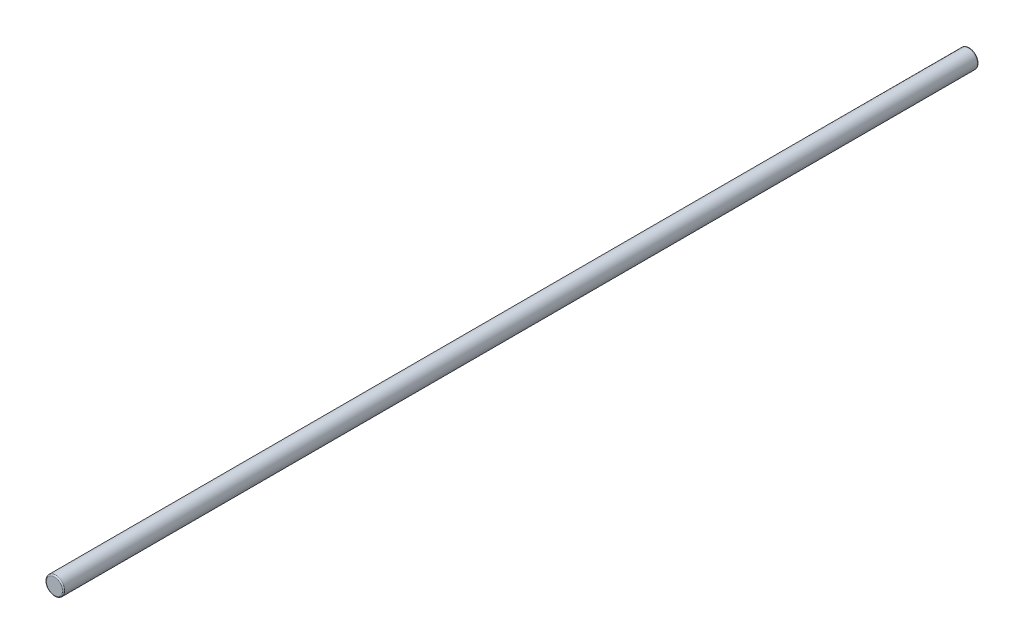
ISO-10303-21;
HEADER;
FILE_DESCRIPTION(('STEP AP214'),'2;1');
FILE_NAME('part.step','',(''),(''),'','','');
FILE_SCHEMA(('AUTOMOTIVE_DESIGN { 1 0 10303 214 1 1 1 1 }'));
ENDSEC;
DATA;
#1=APPLICATION_CONTEXT('core data for automotive mechanical design processes');
#2=APPLICATION_PROTOCOL_DEFINITION('international standard','automotive_design',2000,#1);
#3=PRODUCT_CONTEXT('',#1,'mechanical');
#4=PRODUCT('Part','Part','',(#3));
#5=PRODUCT_RELATED_PRODUCT_CATEGORY('part','',(#4));
#6=PRODUCT_DEFINITION_FORMATION('','',#4);
#7=PRODUCT_DEFINITION_CONTEXT('part definition',#1,'design');
#8=PRODUCT_DEFINITION('design','',#6,#7);
#9=PRODUCT_DEFINITION_SHAPE('','',#8);
#10=(LENGTH_UNIT() NAMED_UNIT(*) SI_UNIT(.MILLI.,.METRE.));
#11=(NAMED_UNIT(*) PLANE_ANGLE_UNIT() SI_UNIT($,.RADIAN.));
#12=(NAMED_UNIT(*) SI_UNIT($,.STERADIAN.) SOLID_ANGLE_UNIT());
#13=UNCERTAINTY_MEASURE_WITH_UNIT(LENGTH_MEASURE(1.E-05),#10,'distance_accuracy_value','');
#14=(GEOMETRIC_REPRESENTATION_CONTEXT(3) GLOBAL_UNCERTAINTY_ASSIGNED_CONTEXT((#13)) GLOBAL_UNIT_ASSIGNED_CONTEXT((#10,
#11,#12)) REPRESENTATION_CONTEXT('',''));
#15=CARTESIAN_POINT('',(0.,0.,0.));
#16=DIRECTION('',(0.,0.,1.));
#17=DIRECTION('',(1.,0.,0.));
#18=AXIS2_PLACEMENT_3D('',#15,#16,#17);
#19=CARTESIAN_POINT('',(0.,0.,400.));
#20=DIRECTION('',(0.,0.,-1.));
#21=DIRECTION('',(-1.,0.,0.));
#22=AXIS2_PLACEMENT_3D('',#19,#20,#21);
#23=CYLINDRICAL_SURFACE('',#22,4.);
#24=CARTESIAN_POINT('',(0.,0.,0.5));
#25=DIRECTION('',(0.,0.,1.));
#26=DIRECTION('',(1.,0.,0.));
#27=AXIS2_PLACEMENT_3D('',#24,#25,#26);
#28=CIRCLE('',#27,4.);
#29=CARTESIAN_POINT('',(4.,0.,0.5));
#30=VERTEX_POINT('',#29);
#31=EDGE_CURVE('E50',#30,#30,#28,.T.);
#32=ORIENTED_EDGE('',*,*,#31,.T.);
#33=EDGE_LOOP('',(#32));
#34=FACE_BOUND('',#33,.T.);
#35=CARTESIAN_POINT('',(0.,0.,399.5));
#36=DIRECTION('',(0.,0.,1.));
#37=DIRECTION('',(1.,0.,0.));
#38=AXIS2_PLACEMENT_3D('',#35,#36,#37);
#39=CIRCLE('',#38,4.);
#40=CARTESIAN_POINT('',(4.,0.,399.5));
#41=VERTEX_POINT('',#40);
#42=EDGE_CURVE('E55',#41,#41,#39,.F.);
#43=ORIENTED_EDGE('',*,*,#42,.T.);
#44=EDGE_LOOP('',(#43));
#45=FACE_BOUND('',#44,.T.);
#46=ADVANCED_FACE('F37',(#34,#45),#23,.T.);
#47=CARTESIAN_POINT('',(0.,0.,400.));
#48=DIRECTION('',(0.,0.,1.));
#49=DIRECTION('',(1.,0.,0.));
#50=AXIS2_PLACEMENT_3D('',#47,#48,#49);
#51=PLANE('',#50);
#52=CARTESIAN_POINT('',(0.,0.,400.));
#53=DIRECTION('',(0.,0.,1.));
#54=DIRECTION('',(1.,0.,0.));
#55=AXIS2_PLACEMENT_3D('',#52,#53,#54);
#56=CIRCLE('',#55,3.5);
#57=CARTESIAN_POINT('',(3.5,0.,400.));
#58=VERTEX_POINT('',#57);
#59=EDGE_CURVE('E10',#58,#58,#56,.T.);
#60=ORIENTED_EDGE('',*,*,#59,.T.);
#61=EDGE_LOOP('',(#60));
#62=FACE_BOUND('',#61,.T.);
#63=ADVANCED_FACE('F72',(#62),#51,.T.);
#64=CARTESIAN_POINT('',(0.,0.,0.));
#65=DIRECTION('',(0.,0.,1.));
#66=DIRECTION('',(1.,0.,0.));
#67=AXIS2_PLACEMENT_3D('',#64,#65,#66);
#68=PLANE('',#67);
#69=CARTESIAN_POINT('',(0.,0.,0.));
#70=DIRECTION('',(0.,0.,1.));
#71=DIRECTION('',(1.,0.,0.));
#72=AXIS2_PLACEMENT_3D('',#69,#70,#71);
#73=CIRCLE('',#72,3.5);
#74=CARTESIAN_POINT('',(3.5,0.,0.));
#75=VERTEX_POINT('',#74);
#76=EDGE_CURVE('E45',#75,#75,#73,.F.);
#77=ORIENTED_EDGE('',*,*,#76,.T.);
#78=EDGE_LOOP('',(#77));
#79=FACE_BOUND('',#78,.T.);
#80=ADVANCED_FACE('F69',(#79),#68,.F.);
#81=CARTESIAN_POINT('',(0.,0.,0.5));
#82=DIRECTION('',(0.,0.,1.));
#83=DIRECTION('',(1.,0.,0.));
#84=AXIS2_PLACEMENT_3D('',#81,#82,#83);
#85=TOROIDAL_SURFACE('',#84,3.5,0.5);
#86=ORIENTED_EDGE('',*,*,#76,.F.);
#87=EDGE_LOOP('',(#86));
#88=FACE_BOUND('',#87,.T.);
#89=ORIENTED_EDGE('',*,*,#31,.F.);
#90=EDGE_LOOP('',(#89));
#91=FACE_BOUND('',#90,.T.);
#92=ADVANCED_FACE('F65',(#88,#91),#85,.T.);
#93=CARTESIAN_POINT('',(0.,0.,399.5));
#94=DIRECTION('',(0.,0.,1.));
#95=DIRECTION('',(1.,0.,0.));
#96=AXIS2_PLACEMENT_3D('',#93,#94,#95);
#97=TOROIDAL_SURFACE('',#96,3.5,0.5);
#98=ORIENTED_EDGE('',*,*,#42,.F.);
#99=EDGE_LOOP('',(#98));
#100=FACE_BOUND('',#99,.T.);
#101=ORIENTED_EDGE('',*,*,#59,.F.);
#102=EDGE_LOOP('',(#101));
#103=FACE_BOUND('',#102,.T.);
#104=ADVANCED_FACE('F39',(#100,#103),#97,.T.);
#105=CLOSED_SHELL('',(#46,#63,#80,#92,#104));
#106=MANIFOLD_SOLID_BREP('B2',#105);
#107=ADVANCED_BREP_SHAPE_REPRESENTATION('',(#18,#106),#14);
#108=SHAPE_DEFINITION_REPRESENTATION(#9,#107);
ENDSEC;
END-ISO-10303-21;
